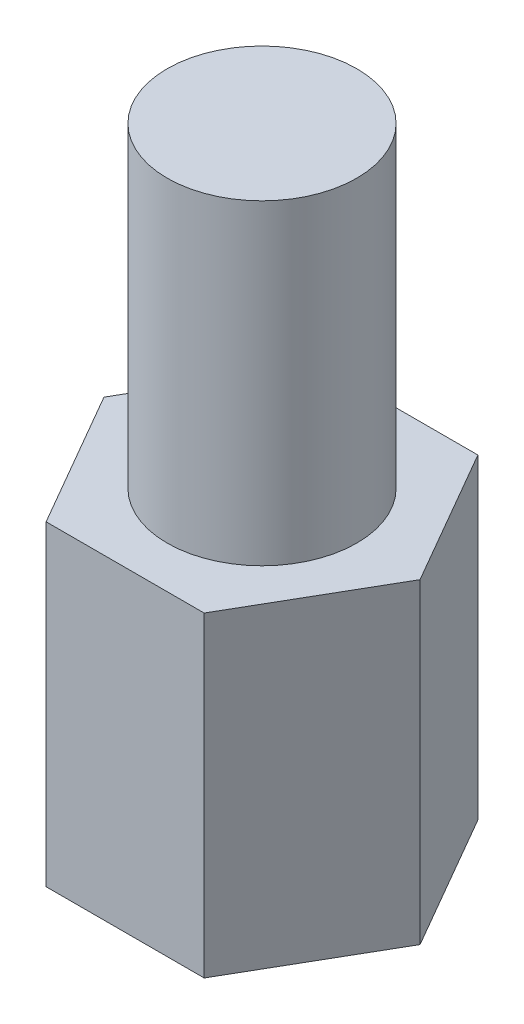
ISO-10303-21;
HEADER;
FILE_DESCRIPTION(('STEP AP214'),'2;1');
FILE_NAME('part.step','',(''),(''),'','','');
FILE_SCHEMA(('AUTOMOTIVE_DESIGN { 1 0 10303 214 1 1 1 1 }'));
ENDSEC;
DATA;
#1=APPLICATION_CONTEXT('core data for automotive mechanical design processes');
#2=APPLICATION_PROTOCOL_DEFINITION('international standard','automotive_design',2000,#1);
#3=PRODUCT_CONTEXT('',#1,'mechanical');
#4=PRODUCT('Part','Part','',(#3));
#5=PRODUCT_RELATED_PRODUCT_CATEGORY('part','',(#4));
#6=PRODUCT_DEFINITION_FORMATION('','',#4);
#7=PRODUCT_DEFINITION_CONTEXT('part definition',#1,'design');
#8=PRODUCT_DEFINITION('design','',#6,#7);
#9=PRODUCT_DEFINITION_SHAPE('','',#8);
#10=(LENGTH_UNIT() NAMED_UNIT(*) SI_UNIT(.MILLI.,.METRE.));
#11=(NAMED_UNIT(*) PLANE_ANGLE_UNIT() SI_UNIT($,.RADIAN.));
#12=(NAMED_UNIT(*) SI_UNIT($,.STERADIAN.) SOLID_ANGLE_UNIT());
#13=UNCERTAINTY_MEASURE_WITH_UNIT(LENGTH_MEASURE(1.E-05),#10,'distance_accuracy_value','');
#14=(GEOMETRIC_REPRESENTATION_CONTEXT(3) GLOBAL_UNCERTAINTY_ASSIGNED_CONTEXT((#13)) GLOBAL_UNIT_ASSIGNED_CONTEXT((#10,
#11,#12)) REPRESENTATION_CONTEXT('',''));
#15=CARTESIAN_POINT('',(0.,0.,0.));
#16=DIRECTION('',(0.,0.,1.));
#17=DIRECTION('',(1.,0.,0.));
#18=AXIS2_PLACEMENT_3D('',#15,#16,#17);
#19=CARTESIAN_POINT('',(0.,5.,0.));
#20=DIRECTION('',(0.,1.,0.));
#21=DIRECTION('',(0.,0.,1.));
#22=AXIS2_PLACEMENT_3D('',#19,#20,#21);
#23=PLANE('',#22);
#24=DIRECTION('',(1.,0.,0.));
#25=VECTOR('',#24,1.);
#26=CARTESIAN_POINT('',(-1.25,5.,2.1650635094611));
#27=LINE('',#26,#25);
#28=CARTESIAN_POINT('',(-1.25,5.,2.1650635094611));
#29=VERTEX_POINT('',#28);
#30=CARTESIAN_POINT('',(1.25,5.,2.1650635094611));
#31=VERTEX_POINT('',#30);
#32=EDGE_CURVE('E129',#29,#31,#27,.T.);
#33=ORIENTED_EDGE('',*,*,#32,.T.);
#34=DIRECTION('',(0.5,0.,-0.866025403784439));
#35=VECTOR('',#34,1.);
#36=CARTESIAN_POINT('',(1.25,5.,2.1650635094611));
#37=LINE('',#36,#35);
#38=CARTESIAN_POINT('',(2.5,5.,0.));
#39=VERTEX_POINT('',#38);
#40=EDGE_CURVE('E87',#31,#39,#37,.T.);
#41=ORIENTED_EDGE('',*,*,#40,.T.);
#42=DIRECTION('',(-0.499999999999999,0.,-0.866025403784439));
#43=VECTOR('',#42,1.);
#44=CARTESIAN_POINT('',(2.5,5.,0.));
#45=LINE('',#44,#43);
#46=CARTESIAN_POINT('',(1.25,5.,-2.1650635094611));
#47=VERTEX_POINT('',#46);
#48=EDGE_CURVE('E100',#39,#47,#45,.T.);
#49=ORIENTED_EDGE('',*,*,#48,.T.);
#50=DIRECTION('',(-1.,0.,0.));
#51=VECTOR('',#50,1.);
#52=CARTESIAN_POINT('',(1.25,5.,-2.1650635094611));
#53=LINE('',#52,#51);
#54=CARTESIAN_POINT('',(-1.25,5.,-2.1650635094611));
#55=VERTEX_POINT('',#54);
#56=EDGE_CURVE('E94',#47,#55,#53,.T.);
#57=ORIENTED_EDGE('',*,*,#56,.T.);
#58=DIRECTION('',(-0.5,0.,0.866025403784438));
#59=VECTOR('',#58,1.);
#60=CARTESIAN_POINT('',(-1.25,5.,-2.1650635094611));
#61=LINE('',#60,#59);
#62=CARTESIAN_POINT('',(-2.5,5.,0.));
#63=VERTEX_POINT('',#62);
#64=EDGE_CURVE('E98',#55,#63,#61,.T.);
#65=ORIENTED_EDGE('',*,*,#64,.T.);
#66=DIRECTION('',(0.499999999999999,0.,0.866025403784439));
#67=VECTOR('',#66,1.);
#68=CARTESIAN_POINT('',(-2.5,5.,0.));
#69=LINE('',#68,#67);
#70=EDGE_CURVE('E50',#63,#29,#69,.T.);
#71=ORIENTED_EDGE('',*,*,#70,.T.);
#72=EDGE_LOOP('',(#33,#41,#49,#57,#65,#71));
#73=FACE_BOUND('',#72,.T.);
#74=CARTESIAN_POINT('',(0.,5.,0.));
#75=DIRECTION('',(0.,1.,0.));
#76=DIRECTION('',(0.,0.,1.));
#77=AXIS2_PLACEMENT_3D('',#74,#75,#76);
#78=CIRCLE('',#77,1.5);
#79=CARTESIAN_POINT('',(0.,5.,1.5));
#80=VERTEX_POINT('',#79);
#81=EDGE_CURVE('E179',#80,#80,#78,.T.);
#82=ORIENTED_EDGE('',*,*,#81,.F.);
#83=EDGE_LOOP('',(#82));
#84=FACE_BOUND('',#83,.T.);
#85=ADVANCED_FACE('F33',(#73,#84),#23,.T.);
#86=CARTESIAN_POINT('',(-1.25,5.,2.1650635094611));
#87=DIRECTION('',(0.,0.,-1.));
#88=DIRECTION('',(-1.,0.,0.));
#89=AXIS2_PLACEMENT_3D('',#86,#87,#88);
#90=PLANE('',#89);
#91=DIRECTION('',(1.,0.,0.));
#92=VECTOR('',#91,1.);
#93=CARTESIAN_POINT('',(-1.25,0.,2.1650635094611));
#94=LINE('',#93,#92);
#95=CARTESIAN_POINT('',(-1.25,0.,2.1650635094611));
#96=VERTEX_POINT('',#95);
#97=CARTESIAN_POINT('',(1.25,0.,2.1650635094611));
#98=VERTEX_POINT('',#97);
#99=EDGE_CURVE('E118',#96,#98,#94,.T.);
#100=ORIENTED_EDGE('',*,*,#99,.T.);
#101=DIRECTION('',(0.,-1.,0.));
#102=VECTOR('',#101,1.);
#103=CARTESIAN_POINT('',(1.25,5.,2.1650635094611));
#104=LINE('',#103,#102);
#105=EDGE_CURVE('E11',#31,#98,#104,.T.);
#106=ORIENTED_EDGE('',*,*,#105,.F.);
#107=ORIENTED_EDGE('',*,*,#32,.F.);
#108=DIRECTION('',(0.,-1.,0.));
#109=VECTOR('',#108,1.);
#110=CARTESIAN_POINT('',(-1.25,5.,2.1650635094611));
#111=LINE('',#110,#109);
#112=EDGE_CURVE('E114',#29,#96,#111,.T.);
#113=ORIENTED_EDGE('',*,*,#112,.T.);
#114=EDGE_LOOP('',(#100,#106,#107,#113));
#115=FACE_BOUND('',#114,.T.);
#116=ADVANCED_FACE('F35',(#115),#90,.F.);
#117=CARTESIAN_POINT('',(1.25,5.,2.1650635094611));
#118=DIRECTION('',(-0.866025403784439,0.,-0.5));
#119=DIRECTION('',(-0.5,0.,0.866025403784439));
#120=AXIS2_PLACEMENT_3D('',#117,#118,#119);
#121=PLANE('',#120);
#122=DIRECTION('',(0.5,0.,-0.866025403784439));
#123=VECTOR('',#122,1.);
#124=CARTESIAN_POINT('',(1.25,0.,2.1650635094611));
#125=LINE('',#124,#123);
#126=CARTESIAN_POINT('',(2.5,0.,0.));
#127=VERTEX_POINT('',#126);
#128=EDGE_CURVE('E121',#98,#127,#125,.T.);
#129=ORIENTED_EDGE('',*,*,#128,.T.);
#130=DIRECTION('',(0.,-1.,0.));
#131=VECTOR('',#130,1.);
#132=CARTESIAN_POINT('',(2.5,5.,0.));
#133=LINE('',#132,#131);
#134=EDGE_CURVE('E42',#39,#127,#133,.T.);
#135=ORIENTED_EDGE('',*,*,#134,.F.);
#136=ORIENTED_EDGE('',*,*,#40,.F.);
#137=ORIENTED_EDGE('',*,*,#105,.T.);
#138=EDGE_LOOP('',(#129,#135,#136,#137));
#139=FACE_BOUND('',#138,.T.);
#140=ADVANCED_FACE('F158',(#139),#121,.F.);
#141=CARTESIAN_POINT('',(2.5,5.,0.));
#142=DIRECTION('',(-0.866025403784439,0.,0.499999999999999));
#143=DIRECTION('',(0.499999999999999,0.,0.866025403784439));
#144=AXIS2_PLACEMENT_3D('',#141,#142,#143);
#145=PLANE('',#144);
#146=DIRECTION('',(-0.499999999999999,0.,-0.866025403784439));
#147=VECTOR('',#146,1.);
#148=CARTESIAN_POINT('',(2.5,0.,0.));
#149=LINE('',#148,#147);
#150=CARTESIAN_POINT('',(1.25,0.,-2.1650635094611));
#151=VERTEX_POINT('',#150);
#152=EDGE_CURVE('E124',#127,#151,#149,.T.);
#153=ORIENTED_EDGE('',*,*,#152,.T.);
#154=DIRECTION('',(0.,-1.,0.));
#155=VECTOR('',#154,1.);
#156=CARTESIAN_POINT('',(1.25,5.,-2.1650635094611));
#157=LINE('',#156,#155);
#158=EDGE_CURVE('E109',#47,#151,#157,.T.);
#159=ORIENTED_EDGE('',*,*,#158,.F.);
#160=ORIENTED_EDGE('',*,*,#48,.F.);
#161=ORIENTED_EDGE('',*,*,#134,.T.);
#162=EDGE_LOOP('',(#153,#159,#160,#161));
#163=FACE_BOUND('',#162,.T.);
#164=ADVANCED_FACE('F135',(#163),#145,.F.);
#165=CARTESIAN_POINT('',(1.25,5.,-2.1650635094611));
#166=DIRECTION('',(0.,0.,1.));
#167=DIRECTION('',(1.,0.,0.));
#168=AXIS2_PLACEMENT_3D('',#165,#166,#167);
#169=PLANE('',#168);
#170=DIRECTION('',(-1.,0.,0.));
#171=VECTOR('',#170,1.);
#172=CARTESIAN_POINT('',(1.25,0.,-2.1650635094611));
#173=LINE('',#172,#171);
#174=CARTESIAN_POINT('',(-1.25,0.,-2.1650635094611));
#175=VERTEX_POINT('',#174);
#176=EDGE_CURVE('E108',#151,#175,#173,.T.);
#177=ORIENTED_EDGE('',*,*,#176,.T.);
#178=DIRECTION('',(0.,-1.,0.));
#179=VECTOR('',#178,1.);
#180=CARTESIAN_POINT('',(-1.25,5.,-2.1650635094611));
#181=LINE('',#180,#179);
#182=EDGE_CURVE('E105',#55,#175,#181,.T.);
#183=ORIENTED_EDGE('',*,*,#182,.F.);
#184=ORIENTED_EDGE('',*,*,#56,.F.);
#185=ORIENTED_EDGE('',*,*,#158,.T.);
#186=EDGE_LOOP('',(#177,#183,#184,#185));
#187=FACE_BOUND('',#186,.T.);
#188=ADVANCED_FACE('F106',(#187),#169,.F.);
#189=CARTESIAN_POINT('',(-1.25,5.,-2.1650635094611));
#190=DIRECTION('',(0.866025403784438,0.,0.5));
#191=DIRECTION('',(0.500000000000001,0.,-0.866025403784438));
#192=AXIS2_PLACEMENT_3D('',#189,#190,#191);
#193=PLANE('',#192);
#194=DIRECTION('',(-0.5,0.,0.866025403784438));
#195=VECTOR('',#194,1.);
#196=CARTESIAN_POINT('',(-1.25,0.,-2.1650635094611));
#197=LINE('',#196,#195);
#198=CARTESIAN_POINT('',(-2.5,0.,0.));
#199=VERTEX_POINT('',#198);
#200=EDGE_CURVE('E73',#175,#199,#197,.T.);
#201=ORIENTED_EDGE('',*,*,#200,.T.);
#202=DIRECTION('',(0.,-1.,0.));
#203=VECTOR('',#202,1.);
#204=CARTESIAN_POINT('',(-2.5,5.,0.));
#205=LINE('',#204,#203);
#206=EDGE_CURVE('E110',#63,#199,#205,.T.);
#207=ORIENTED_EDGE('',*,*,#206,.F.);
#208=ORIENTED_EDGE('',*,*,#64,.F.);
#209=ORIENTED_EDGE('',*,*,#182,.T.);
#210=EDGE_LOOP('',(#201,#207,#208,#209));
#211=FACE_BOUND('',#210,.T.);
#212=ADVANCED_FACE('F112',(#211),#193,.F.);
#213=CARTESIAN_POINT('',(-2.5,5.,0.));
#214=DIRECTION('',(0.866025403784439,0.,-0.499999999999999));
#215=DIRECTION('',(-0.499999999999999,0.,-0.866025403784439));
#216=AXIS2_PLACEMENT_3D('',#213,#214,#215);
#217=PLANE('',#216);
#218=DIRECTION('',(0.499999999999999,0.,0.866025403784439));
#219=VECTOR('',#218,1.);
#220=CARTESIAN_POINT('',(-2.5,0.,0.));
#221=LINE('',#220,#219);
#222=EDGE_CURVE('E79',#199,#96,#221,.T.);
#223=ORIENTED_EDGE('',*,*,#222,.T.);
#224=ORIENTED_EDGE('',*,*,#112,.F.);
#225=ORIENTED_EDGE('',*,*,#70,.F.);
#226=ORIENTED_EDGE('',*,*,#206,.T.);
#227=EDGE_LOOP('',(#223,#224,#225,#226));
#228=FACE_BOUND('',#227,.T.);
#229=ADVANCED_FACE('F142',(#228),#217,.F.);
#230=CARTESIAN_POINT('',(0.,0.,0.));
#231=DIRECTION('',(0.,1.,0.));
#232=DIRECTION('',(0.,0.,1.));
#233=AXIS2_PLACEMENT_3D('',#230,#231,#232);
#234=PLANE('',#233);
#235=CARTESIAN_POINT('',(0.,0.,0.));
#236=DIRECTION('',(0.,-1.,0.));
#237=DIRECTION('',(0.,0.,-1.));
#238=AXIS2_PLACEMENT_3D('',#235,#236,#237);
#239=CIRCLE('',#238,1.5);
#240=CARTESIAN_POINT('',(0.,0.,-1.5));
#241=VERTEX_POINT('',#240);
#242=EDGE_CURVE('E180',#241,#241,#239,.T.);
#243=ORIENTED_EDGE('',*,*,#242,.F.);
#244=EDGE_LOOP('',(#243));
#245=FACE_BOUND('',#244,.T.);
#246=ORIENTED_EDGE('',*,*,#99,.F.);
#247=ORIENTED_EDGE('',*,*,#222,.F.);
#248=ORIENTED_EDGE('',*,*,#200,.F.);
#249=ORIENTED_EDGE('',*,*,#176,.F.);
#250=ORIENTED_EDGE('',*,*,#152,.F.);
#251=ORIENTED_EDGE('',*,*,#128,.F.);
#252=EDGE_LOOP('',(#246,#247,#248,#249,#250,#251));
#253=FACE_BOUND('',#252,.T.);
#254=ADVANCED_FACE('F138',(#245,#253),#234,.F.);
#255=CARTESIAN_POINT('',(0.,10.,0.));
#256=DIRECTION('',(0.,-1.,0.));
#257=DIRECTION('',(0.,0.,-1.));
#258=AXIS2_PLACEMENT_3D('',#255,#256,#257);
#259=CYLINDRICAL_SURFACE('',#258,1.5);
#260=CARTESIAN_POINT('',(0.,10.,0.));
#261=DIRECTION('',(0.,1.,0.));
#262=DIRECTION('',(0.,0.,1.));
#263=AXIS2_PLACEMENT_3D('',#260,#261,#262);
#264=CIRCLE('',#263,1.5);
#265=CARTESIAN_POINT('',(0.,10.,1.5));
#266=VERTEX_POINT('',#265);
#267=EDGE_CURVE('E122',#266,#266,#264,.T.);
#268=ORIENTED_EDGE('',*,*,#267,.F.);
#269=EDGE_LOOP('',(#268));
#270=FACE_BOUND('',#269,.T.);
#271=ORIENTED_EDGE('',*,*,#81,.T.);
#272=EDGE_LOOP('',(#271));
#273=FACE_BOUND('',#272,.T.);
#274=ADVANCED_FACE('F149',(#270,#273),#259,.T.);
#275=CARTESIAN_POINT('',(0.,10.,0.));
#276=DIRECTION('',(0.,1.,0.));
#277=DIRECTION('',(0.,0.,1.));
#278=AXIS2_PLACEMENT_3D('',#275,#276,#277);
#279=PLANE('',#278);
#280=ORIENTED_EDGE('',*,*,#267,.T.);
#281=EDGE_LOOP('',(#280));
#282=FACE_BOUND('',#281,.T.);
#283=ADVANCED_FACE('F162',(#282),#279,.T.);
#284=CARTESIAN_POINT('',(0.,3.,0.));
#285=DIRECTION('',(0.,-1.,0.));
#286=DIRECTION('',(0.,0.,-1.));
#287=AXIS2_PLACEMENT_3D('',#284,#285,#286);
#288=CYLINDRICAL_SURFACE('',#287,1.5);
#289=CARTESIAN_POINT('',(0.,3.,0.));
#290=DIRECTION('',(0.,-1.,0.));
#291=DIRECTION('',(0.,0.,-1.));
#292=AXIS2_PLACEMENT_3D('',#289,#290,#291);
#293=CIRCLE('',#292,1.5);
#294=CARTESIAN_POINT('',(0.,3.,-1.5));
#295=VERTEX_POINT('',#294);
#296=EDGE_CURVE('E178',#295,#295,#293,.T.);
#297=ORIENTED_EDGE('',*,*,#296,.F.);
#298=EDGE_LOOP('',(#297));
#299=FACE_BOUND('',#298,.T.);
#300=ORIENTED_EDGE('',*,*,#242,.T.);
#301=EDGE_LOOP('',(#300));
#302=FACE_BOUND('',#301,.T.);
#303=ADVANCED_FACE('F166',(#299,#302),#288,.F.);
#304=CARTESIAN_POINT('',(0.,3.,0.));
#305=DIRECTION('',(0.,-1.,0.));
#306=DIRECTION('',(0.,0.,-1.));
#307=AXIS2_PLACEMENT_3D('',#304,#305,#306);
#308=PLANE('',#307);
#309=ORIENTED_EDGE('',*,*,#296,.T.);
#310=EDGE_LOOP('',(#309));
#311=FACE_BOUND('',#310,.T.);
#312=ADVANCED_FACE('F170',(#311),#308,.T.);
#313=CLOSED_SHELL('',(#85,#116,#140,#164,#188,#212,#229,#254,#274,#283,#303,#312));
#314=MANIFOLD_SOLID_BREP('B2',#313);
#315=ADVANCED_BREP_SHAPE_REPRESENTATION('',(#18,#314),#14);
#316=SHAPE_DEFINITION_REPRESENTATION(#9,#315);
ENDSEC;
END-ISO-10303-21;
